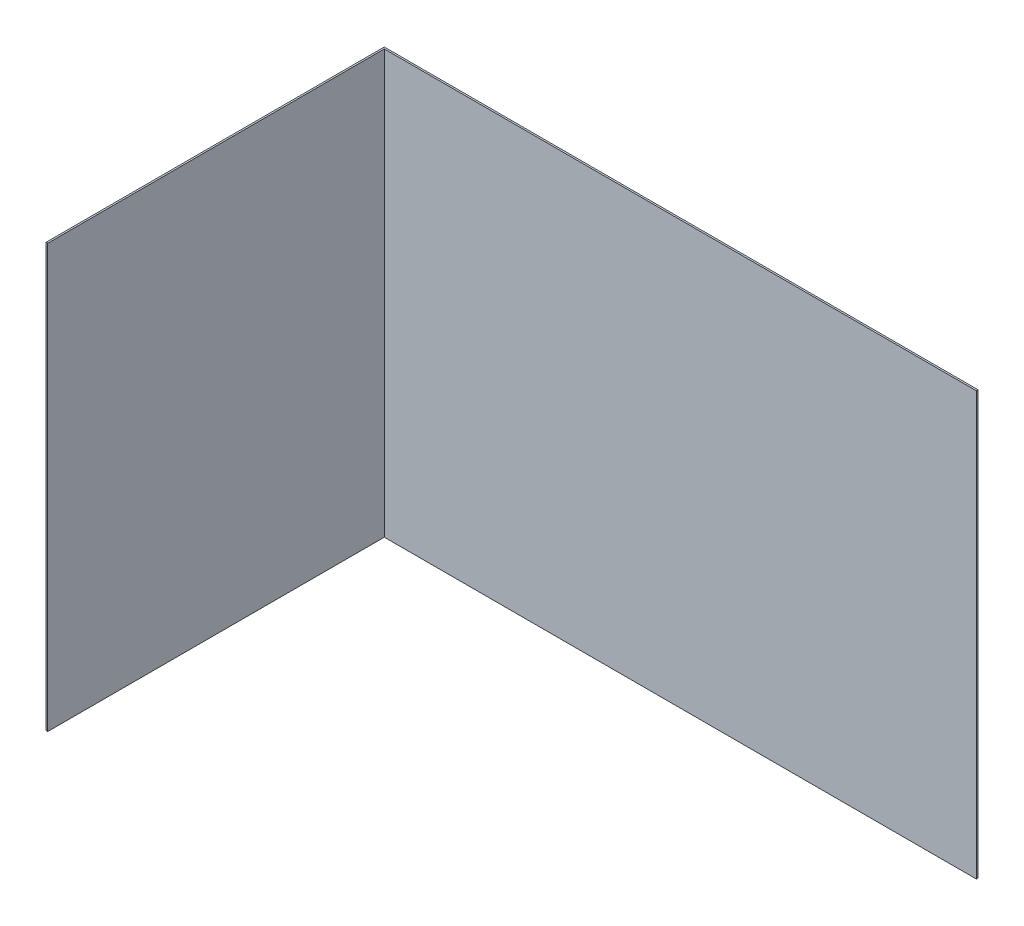
ISO-10303-21;
HEADER;
FILE_DESCRIPTION(('STEP AP214'),'2;1');
FILE_NAME('part.step','',(''),(''),'','','');
FILE_SCHEMA(('AUTOMOTIVE_DESIGN { 1 0 10303 214 1 1 1 1 }'));
ENDSEC;
DATA;
#1=APPLICATION_CONTEXT('core data for automotive mechanical design processes');
#2=APPLICATION_PROTOCOL_DEFINITION('international standard','automotive_design',2000,#1);
#3=PRODUCT_CONTEXT('',#1,'mechanical');
#4=PRODUCT('Part','Part','',(#3));
#5=PRODUCT_RELATED_PRODUCT_CATEGORY('part','',(#4));
#6=PRODUCT_DEFINITION_FORMATION('','',#4);
#7=PRODUCT_DEFINITION_CONTEXT('part definition',#1,'design');
#8=PRODUCT_DEFINITION('design','',#6,#7);
#9=PRODUCT_DEFINITION_SHAPE('','',#8);
#10=(LENGTH_UNIT() NAMED_UNIT(*) SI_UNIT(.MILLI.,.METRE.));
#11=(NAMED_UNIT(*) PLANE_ANGLE_UNIT() SI_UNIT($,.RADIAN.));
#12=(NAMED_UNIT(*) SI_UNIT($,.STERADIAN.) SOLID_ANGLE_UNIT());
#13=UNCERTAINTY_MEASURE_WITH_UNIT(LENGTH_MEASURE(1.E-05),#10,'distance_accuracy_value','');
#14=(GEOMETRIC_REPRESENTATION_CONTEXT(3) GLOBAL_UNCERTAINTY_ASSIGNED_CONTEXT((#13)) GLOBAL_UNIT_ASSIGNED_CONTEXT((#10,
#11,#12)) REPRESENTATION_CONTEXT('',''));
#15=CARTESIAN_POINT('',(0.,0.,0.));
#16=DIRECTION('',(0.,0.,1.));
#17=DIRECTION('',(1.,0.,0.));
#18=AXIS2_PLACEMENT_3D('',#15,#16,#17);
#19=CARTESIAN_POINT('',(0.,0.,0.2));
#20=DIRECTION('',(0.,0.,-1.));
#21=DIRECTION('',(-1.,0.,0.));
#22=AXIS2_PLACEMENT_3D('',#19,#20,#21);
#23=PLANE('',#22);
#24=DIRECTION('',(-1.,0.,0.));
#25=VECTOR('',#24,1.);
#26=CARTESIAN_POINT('',(0.,0.25,0.2));
#27=LINE('',#26,#25);
#28=CARTESIAN_POINT('',(0.,0.25,0.2));
#29=VERTEX_POINT('',#28);
#30=CARTESIAN_POINT('',(-0.00100000000000002,0.25,0.2));
#31=VERTEX_POINT('',#30);
#32=EDGE_CURVE('E88',#29,#31,#27,.T.);
#33=ORIENTED_EDGE('',*,*,#32,.T.);
#34=DIRECTION('',(0.,1.,0.));
#35=VECTOR('',#34,1.);
#36=CARTESIAN_POINT('',(-0.00100000000000004,0.,0.2));
#37=LINE('',#36,#35);
#38=CARTESIAN_POINT('',(-0.00100000000000004,0.,0.2));
#39=VERTEX_POINT('',#38);
#40=EDGE_CURVE('E72',#31,#39,#37,.F.);
#41=ORIENTED_EDGE('',*,*,#40,.T.);
#42=DIRECTION('',(-1.,0.,0.));
#43=VECTOR('',#42,1.);
#44=CARTESIAN_POINT('',(0.,0.,0.2));
#45=LINE('',#44,#43);
#46=CARTESIAN_POINT('',(0.,0.,0.2));
#47=VERTEX_POINT('',#46);
#48=EDGE_CURVE('E20',#39,#47,#45,.F.);
#49=ORIENTED_EDGE('',*,*,#48,.T.);
#50=DIRECTION('',(0.,1.,0.));
#51=VECTOR('',#50,1.);
#52=CARTESIAN_POINT('',(0.,0.,0.2));
#53=LINE('',#52,#51);
#54=EDGE_CURVE('E77',#29,#47,#53,.F.);
#55=ORIENTED_EDGE('',*,*,#54,.F.);
#56=EDGE_LOOP('',(#33,#41,#49,#55));
#57=FACE_BOUND('',#56,.T.);
#58=ADVANCED_FACE('F17',(#57),#23,.F.);
#59=CARTESIAN_POINT('',(0.,0.,0.));
#60=DIRECTION('',(1.,0.,0.));
#61=DIRECTION('',(0.,0.,-1.));
#62=AXIS2_PLACEMENT_3D('',#59,#60,#61);
#63=PLANE('',#62);
#64=DIRECTION('',(0.,0.,-1.));
#65=VECTOR('',#64,1.);
#66=CARTESIAN_POINT('',(0.,0.25,0.));
#67=LINE('',#66,#65);
#68=CARTESIAN_POINT('',(0.,0.25,0.000999999999999999));
#69=VERTEX_POINT('',#68);
#70=EDGE_CURVE('E111',#69,#29,#67,.F.);
#71=ORIENTED_EDGE('',*,*,#70,.T.);
#72=ORIENTED_EDGE('',*,*,#54,.T.);
#73=DIRECTION('',(0.,0.,-1.));
#74=VECTOR('',#73,1.);
#75=CARTESIAN_POINT('',(0.,0.,0.));
#76=LINE('',#75,#74);
#77=CARTESIAN_POINT('',(0.,0.,0.001));
#78=VERTEX_POINT('',#77);
#79=EDGE_CURVE('E83',#47,#78,#76,.T.);
#80=ORIENTED_EDGE('',*,*,#79,.T.);
#81=DIRECTION('',(0.,1.,0.));
#82=VECTOR('',#81,1.);
#83=CARTESIAN_POINT('',(0.,0.,0.001));
#84=LINE('',#83,#82);
#85=EDGE_CURVE('E100',#78,#69,#84,.T.);
#86=ORIENTED_EDGE('',*,*,#85,.T.);
#87=EDGE_LOOP('',(#71,#72,#80,#86));
#88=FACE_BOUND('',#87,.T.);
#89=ADVANCED_FACE('F112',(#88),#63,.T.);
#90=CARTESIAN_POINT('',(-0.001,0.25,0.));
#91=DIRECTION('',(1.,0.,0.));
#92=DIRECTION('',(0.,0.,-1.));
#93=AXIS2_PLACEMENT_3D('',#90,#91,#92);
#94=PLANE('',#93);
#95=DIRECTION('',(0.,0.,1.));
#96=VECTOR('',#95,1.);
#97=CARTESIAN_POINT('',(-0.001,0.,0.));
#98=LINE('',#97,#96);
#99=CARTESIAN_POINT('',(-0.001,0.,0.));
#100=VERTEX_POINT('',#99);
#101=EDGE_CURVE('E67',#39,#100,#98,.F.);
#102=ORIENTED_EDGE('',*,*,#101,.F.);
#103=ORIENTED_EDGE('',*,*,#40,.F.);
#104=DIRECTION('',(0.,0.,-1.));
#105=VECTOR('',#104,1.);
#106=CARTESIAN_POINT('',(-0.001,0.25,0.));
#107=LINE('',#106,#105);
#108=CARTESIAN_POINT('',(-0.001,0.25,0.));
#109=VERTEX_POINT('',#108);
#110=EDGE_CURVE('E76',#31,#109,#107,.T.);
#111=ORIENTED_EDGE('',*,*,#110,.T.);
#112=DIRECTION('',(0.,1.,0.));
#113=VECTOR('',#112,1.);
#114=CARTESIAN_POINT('',(-0.001,0.,0.));
#115=LINE('',#114,#113);
#116=EDGE_CURVE('E74',#100,#109,#115,.T.);
#117=ORIENTED_EDGE('',*,*,#116,.F.);
#118=EDGE_LOOP('',(#102,#103,#111,#117));
#119=FACE_BOUND('',#118,.T.);
#120=ADVANCED_FACE('F69',(#119),#94,.F.);
#121=CARTESIAN_POINT('',(-0.001,0.,0.001));
#122=DIRECTION('',(0.,0.,-1.));
#123=DIRECTION('',(-1.,0.,0.));
#124=AXIS2_PLACEMENT_3D('',#121,#122,#123);
#125=PLANE('',#124);
#126=DIRECTION('',(1.,0.,0.));
#127=VECTOR('',#126,1.);
#128=CARTESIAN_POINT('',(0.35,0.25,0.001));
#129=LINE('',#128,#127);
#130=CARTESIAN_POINT('',(0.35,0.25,0.001));
#131=VERTEX_POINT('',#130);
#132=EDGE_CURVE('E99',#131,#69,#129,.F.);
#133=ORIENTED_EDGE('',*,*,#132,.T.);
#134=ORIENTED_EDGE('',*,*,#85,.F.);
#135=DIRECTION('',(1.,0.,0.));
#136=VECTOR('',#135,1.);
#137=CARTESIAN_POINT('',(-0.001,0.,0.001));
#138=LINE('',#137,#136);
#139=CARTESIAN_POINT('',(0.35,0.,0.001));
#140=VERTEX_POINT('',#139);
#141=EDGE_CURVE('E102',#78,#140,#138,.T.);
#142=ORIENTED_EDGE('',*,*,#141,.T.);
#143=DIRECTION('',(0.,1.,0.));
#144=VECTOR('',#143,1.);
#145=CARTESIAN_POINT('',(0.35,0.,0.001));
#146=LINE('',#145,#144);
#147=EDGE_CURVE('E95',#140,#131,#146,.T.);
#148=ORIENTED_EDGE('',*,*,#147,.T.);
#149=EDGE_LOOP('',(#133,#134,#142,#148));
#150=FACE_BOUND('',#149,.T.);
#151=ADVANCED_FACE('F114',(#150),#125,.F.);
#152=CARTESIAN_POINT('',(-0.001,0.,0.));
#153=DIRECTION('',(0.,1.,0.));
#154=DIRECTION('',(0.,0.,1.));
#155=AXIS2_PLACEMENT_3D('',#152,#153,#154);
#156=PLANE('',#155);
#157=ORIENTED_EDGE('',*,*,#141,.F.);
#158=ORIENTED_EDGE('',*,*,#79,.F.);
#159=ORIENTED_EDGE('',*,*,#48,.F.);
#160=ORIENTED_EDGE('',*,*,#101,.T.);
#161=DIRECTION('',(-1.,0.,0.));
#162=VECTOR('',#161,1.);
#163=CARTESIAN_POINT('',(-0.001,0.,0.));
#164=LINE('',#163,#162);
#165=CARTESIAN_POINT('',(0.35,0.,0.));
#166=VERTEX_POINT('',#165);
#167=EDGE_CURVE('E94',#166,#100,#164,.T.);
#168=ORIENTED_EDGE('',*,*,#167,.F.);
#169=DIRECTION('',(0.,0.,1.));
#170=VECTOR('',#169,1.);
#171=CARTESIAN_POINT('',(0.35,0.,0.));
#172=LINE('',#171,#170);
#173=EDGE_CURVE('E96',#166,#140,#172,.T.);
#174=ORIENTED_EDGE('',*,*,#173,.T.);
#175=EDGE_LOOP('',(#157,#158,#159,#160,#168,#174));
#176=FACE_BOUND('',#175,.T.);
#177=ADVANCED_FACE('F82',(#176),#156,.F.);
#178=CARTESIAN_POINT('',(0.35,0.25,0.));
#179=DIRECTION('',(0.,-1.,0.));
#180=DIRECTION('',(0.,0.,-1.));
#181=AXIS2_PLACEMENT_3D('',#178,#179,#180);
#182=PLANE('',#181);
#183=ORIENTED_EDGE('',*,*,#132,.F.);
#184=DIRECTION('',(0.,0.,-1.));
#185=VECTOR('',#184,1.);
#186=CARTESIAN_POINT('',(0.35,0.25,0.));
#187=LINE('',#186,#185);
#188=CARTESIAN_POINT('',(0.35,0.25,0.));
#189=VERTEX_POINT('',#188);
#190=EDGE_CURVE('E35',#131,#189,#187,.T.);
#191=ORIENTED_EDGE('',*,*,#190,.T.);
#192=DIRECTION('',(-1.,0.,0.));
#193=VECTOR('',#192,1.);
#194=CARTESIAN_POINT('',(-0.001,0.25,0.));
#195=LINE('',#194,#193);
#196=EDGE_CURVE('E26',#109,#189,#195,.F.);
#197=ORIENTED_EDGE('',*,*,#196,.F.);
#198=ORIENTED_EDGE('',*,*,#110,.F.);
#199=ORIENTED_EDGE('',*,*,#32,.F.);
#200=ORIENTED_EDGE('',*,*,#70,.F.);
#201=EDGE_LOOP('',(#183,#191,#197,#198,#199,#200));
#202=FACE_BOUND('',#201,.T.);
#203=ADVANCED_FACE('F127',(#202),#182,.F.);
#204=CARTESIAN_POINT('',(0.35,0.,0.));
#205=DIRECTION('',(-1.,0.,0.));
#206=DIRECTION('',(0.,0.,1.));
#207=AXIS2_PLACEMENT_3D('',#204,#205,#206);
#208=PLANE('',#207);
#209=ORIENTED_EDGE('',*,*,#190,.F.);
#210=ORIENTED_EDGE('',*,*,#147,.F.);
#211=ORIENTED_EDGE('',*,*,#173,.F.);
#212=DIRECTION('',(0.,1.,0.));
#213=VECTOR('',#212,1.);
#214=CARTESIAN_POINT('',(0.35,0.,0.));
#215=LINE('',#214,#213);
#216=EDGE_CURVE('E11',#189,#166,#215,.F.);
#217=ORIENTED_EDGE('',*,*,#216,.F.);
#218=EDGE_LOOP('',(#209,#210,#211,#217));
#219=FACE_BOUND('',#218,.T.);
#220=ADVANCED_FACE('F119',(#219),#208,.F.);
#221=CARTESIAN_POINT('',(-0.001,0.,0.));
#222=DIRECTION('',(0.,0.,-1.));
#223=DIRECTION('',(-1.,0.,0.));
#224=AXIS2_PLACEMENT_3D('',#221,#222,#223);
#225=PLANE('',#224);
#226=ORIENTED_EDGE('',*,*,#196,.T.);
#227=ORIENTED_EDGE('',*,*,#216,.T.);
#228=ORIENTED_EDGE('',*,*,#167,.T.);
#229=ORIENTED_EDGE('',*,*,#116,.T.);
#230=EDGE_LOOP('',(#226,#227,#228,#229));
#231=FACE_BOUND('',#230,.T.);
#232=ADVANCED_FACE('F126',(#231),#225,.T.);
#233=CLOSED_SHELL('',(#58,#89,#120,#151,#177,#203,#220,#232));
#234=MANIFOLD_SOLID_BREP('B1',#233);
#235=ADVANCED_BREP_SHAPE_REPRESENTATION('',(#18,#234),#14);
#236=SHAPE_DEFINITION_REPRESENTATION(#9,#235);
ENDSEC;
END-ISO-10303-21;
